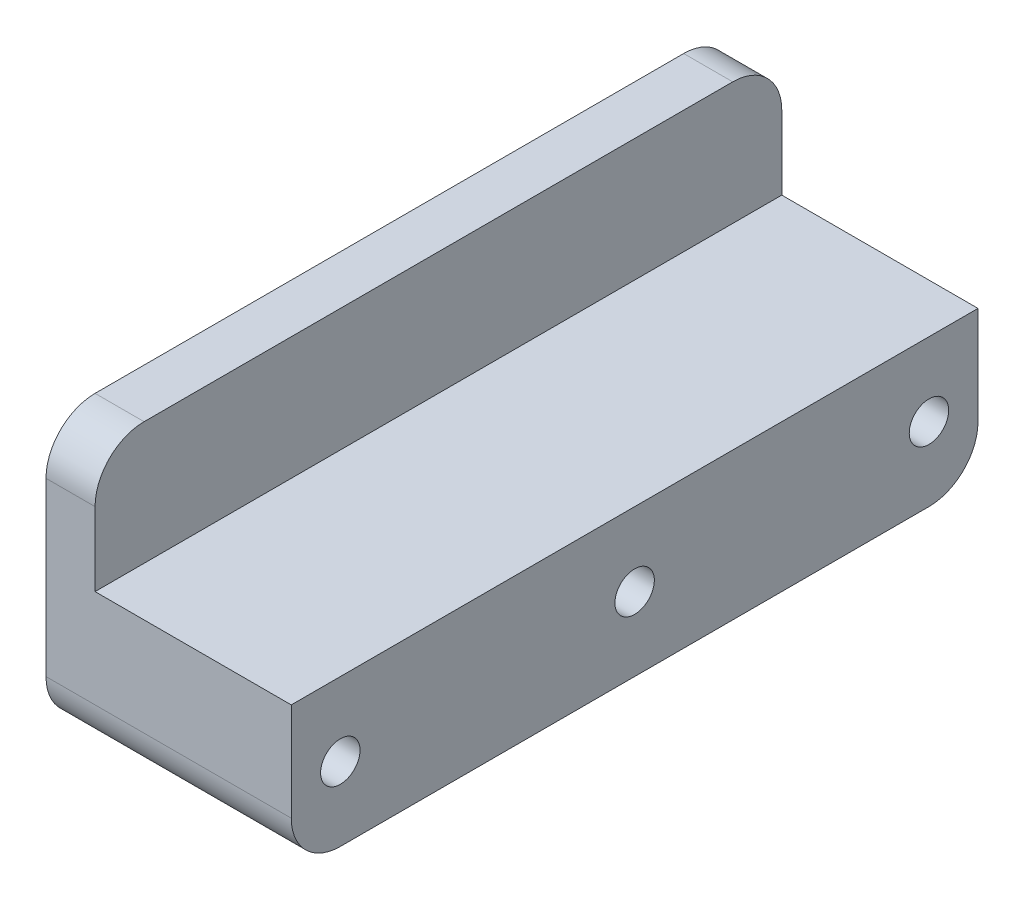
ISO-10303-21;
HEADER;
FILE_DESCRIPTION(('STEP AP214'),'2;1');
FILE_NAME('part.step','',(''),(''),'','','');
FILE_SCHEMA(('AUTOMOTIVE_DESIGN { 1 0 10303 214 1 1 1 1 }'));
ENDSEC;
DATA;
#1=APPLICATION_CONTEXT('core data for automotive mechanical design processes');
#2=APPLICATION_PROTOCOL_DEFINITION('international standard','automotive_design',2000,#1);
#3=PRODUCT_CONTEXT('',#1,'mechanical');
#4=PRODUCT('Part','Part','',(#3));
#5=PRODUCT_RELATED_PRODUCT_CATEGORY('part','',(#4));
#6=PRODUCT_DEFINITION_FORMATION('','',#4);
#7=PRODUCT_DEFINITION_CONTEXT('part definition',#1,'design');
#8=PRODUCT_DEFINITION('design','',#6,#7);
#9=PRODUCT_DEFINITION_SHAPE('','',#8);
#10=(LENGTH_UNIT() NAMED_UNIT(*) SI_UNIT(.MILLI.,.METRE.));
#11=(NAMED_UNIT(*) PLANE_ANGLE_UNIT() SI_UNIT($,.RADIAN.));
#12=(NAMED_UNIT(*) SI_UNIT($,.STERADIAN.) SOLID_ANGLE_UNIT());
#13=UNCERTAINTY_MEASURE_WITH_UNIT(LENGTH_MEASURE(1.E-05),#10,'distance_accuracy_value','');
#14=(GEOMETRIC_REPRESENTATION_CONTEXT(3) GLOBAL_UNCERTAINTY_ASSIGNED_CONTEXT((#13)) GLOBAL_UNIT_ASSIGNED_CONTEXT((#10,
#11,#12)) REPRESENTATION_CONTEXT('',''));
#15=CARTESIAN_POINT('',(0.,0.,0.));
#16=DIRECTION('',(0.,0.,1.));
#17=DIRECTION('',(1.,0.,0.));
#18=AXIS2_PLACEMENT_3D('',#15,#16,#17);
#19=CARTESIAN_POINT('',(317.498,-30.8912950776032,368.3));
#20=DIRECTION('',(1.,0.,0.));
#21=DIRECTION('',(0.,1.,0.));
#22=AXIS2_PLACEMENT_3D('',#19,#20,#21);
#23=CYLINDRICAL_SURFACE('',#22,2.5527);
#24=CARTESIAN_POINT('',(342.9,-30.8912950776032,368.3));
#25=DIRECTION('',(1.,0.,0.));
#26=DIRECTION('',(0.,1.,0.));
#27=AXIS2_PLACEMENT_3D('',#24,#25,#26);
#28=CIRCLE('',#27,2.5527);
#29=CARTESIAN_POINT('',(342.9,-28.3385950776032,368.3));
#30=VERTEX_POINT('',#29);
#31=EDGE_CURVE('E440',#30,#30,#28,.T.);
#32=ORIENTED_EDGE('',*,*,#31,.T.);
#33=EDGE_LOOP('',(#32));
#34=FACE_BOUND('',#33,.T.);
#35=CARTESIAN_POINT('',(336.55,-30.8912950776032,368.3));
#36=DIRECTION('',(-1.,0.,0.));
#37=DIRECTION('',(0.,-1.,0.));
#38=AXIS2_PLACEMENT_3D('',#35,#36,#37);
#39=CIRCLE('',#38,2.5527);
#40=CARTESIAN_POINT('',(336.55,-33.4439950776032,368.3));
#41=VERTEX_POINT('',#40);
#42=EDGE_CURVE('E21',#41,#41,#39,.F.);
#43=ORIENTED_EDGE('',*,*,#42,.F.);
#44=EDGE_LOOP('',(#43));
#45=FACE_BOUND('',#44,.T.);
#46=ADVANCED_FACE('F17',(#34,#45),#23,.F.);
#47=CARTESIAN_POINT('',(317.498,-30.8912950776032,406.4));
#48=DIRECTION('',(1.,0.,0.));
#49=DIRECTION('',(0.,1.,0.));
#50=AXIS2_PLACEMENT_3D('',#47,#48,#49);
#51=CYLINDRICAL_SURFACE('',#50,2.5527);
#52=CARTESIAN_POINT('',(342.9,-30.8912950776032,406.4));
#53=DIRECTION('',(1.,0.,0.));
#54=DIRECTION('',(0.,1.,0.));
#55=AXIS2_PLACEMENT_3D('',#52,#53,#54);
#56=CIRCLE('',#55,2.5527);
#57=CARTESIAN_POINT('',(342.9,-28.3385950776032,406.4));
#58=VERTEX_POINT('',#57);
#59=EDGE_CURVE('E435',#58,#58,#56,.T.);
#60=ORIENTED_EDGE('',*,*,#59,.T.);
#61=EDGE_LOOP('',(#60));
#62=FACE_BOUND('',#61,.T.);
#63=CARTESIAN_POINT('',(336.55,-30.8912950776032,406.4));
#64=DIRECTION('',(-1.,0.,0.));
#65=DIRECTION('',(0.,-1.,0.));
#66=AXIS2_PLACEMENT_3D('',#63,#64,#65);
#67=CIRCLE('',#66,2.5527);
#68=CARTESIAN_POINT('',(336.55,-33.4439950776032,406.4));
#69=VERTEX_POINT('',#68);
#70=EDGE_CURVE('E519',#69,#69,#67,.F.);
#71=ORIENTED_EDGE('',*,*,#70,.F.);
#72=EDGE_LOOP('',(#71));
#73=FACE_BOUND('',#72,.T.);
#74=ADVANCED_FACE('F529',(#62,#73),#51,.F.);
#75=CARTESIAN_POINT('',(317.498,-30.8912950776032,444.5));
#76=DIRECTION('',(1.,0.,0.));
#77=DIRECTION('',(0.,1.,0.));
#78=AXIS2_PLACEMENT_3D('',#75,#76,#77);
#79=CYLINDRICAL_SURFACE('',#78,2.5527);
#80=CARTESIAN_POINT('',(342.9,-30.8912950776032,444.5));
#81=DIRECTION('',(1.,0.,0.));
#82=DIRECTION('',(0.,1.,0.));
#83=AXIS2_PLACEMENT_3D('',#80,#81,#82);
#84=CIRCLE('',#83,2.5527);
#85=CARTESIAN_POINT('',(342.9,-28.3385950776032,444.5));
#86=VERTEX_POINT('',#85);
#87=EDGE_CURVE('E431',#86,#86,#84,.T.);
#88=ORIENTED_EDGE('',*,*,#87,.T.);
#89=EDGE_LOOP('',(#88));
#90=FACE_BOUND('',#89,.T.);
#91=CARTESIAN_POINT('',(336.55,-30.8912950776032,444.5));
#92=DIRECTION('',(-1.,0.,0.));
#93=DIRECTION('',(0.,-1.,0.));
#94=AXIS2_PLACEMENT_3D('',#91,#92,#93);
#95=CIRCLE('',#94,2.5527);
#96=CARTESIAN_POINT('',(336.55,-33.4439950776032,444.5));
#97=VERTEX_POINT('',#96);
#98=EDGE_CURVE('E265',#97,#97,#95,.F.);
#99=ORIENTED_EDGE('',*,*,#98,.F.);
#100=EDGE_LOOP('',(#99));
#101=FACE_BOUND('',#100,.T.);
#102=ADVANCED_FACE('F535',(#90,#101),#79,.F.);
#103=CARTESIAN_POINT('',(317.498,-40.4162950776019,406.4));
#104=DIRECTION('',(0.,1.,0.));
#105=DIRECTION('',(-1.,0.,0.));
#106=AXIS2_PLACEMENT_3D('',#103,#104,#105);
#107=PLANE('',#106);
#108=DIRECTION('',(0.,0.,1.));
#109=VECTOR('',#108,1.);
#110=CARTESIAN_POINT('',(311.15,-40.4162950776019,406.4));
#111=LINE('',#110,#109);
#112=CARTESIAN_POINT('',(311.15,-40.4162950776019,368.3));
#113=VERTEX_POINT('',#112);
#114=CARTESIAN_POINT('',(311.15,-40.4162950776019,444.5));
#115=VERTEX_POINT('',#114);
#116=EDGE_CURVE('E417',#113,#115,#111,.T.);
#117=ORIENTED_EDGE('',*,*,#116,.F.);
#118=DIRECTION('',(1.,0.,0.));
#119=VECTOR('',#118,1.);
#120=CARTESIAN_POINT('',(342.9,-40.4162950776019,368.3));
#121=LINE('',#120,#119);
#122=CARTESIAN_POINT('',(342.9,-40.4162950776019,368.3));
#123=VERTEX_POINT('',#122);
#124=EDGE_CURVE('E481',#113,#123,#121,.T.);
#125=ORIENTED_EDGE('',*,*,#124,.T.);
#126=DIRECTION('',(0.,0.,1.));
#127=VECTOR('',#126,1.);
#128=CARTESIAN_POINT('',(342.9,-40.4162950776019,406.4));
#129=LINE('',#128,#127);
#130=CARTESIAN_POINT('',(342.9,-40.4162950776019,444.5));
#131=VERTEX_POINT('',#130);
#132=EDGE_CURVE('E444',#123,#131,#129,.T.);
#133=ORIENTED_EDGE('',*,*,#132,.T.);
#134=DIRECTION('',(1.,0.,0.));
#135=VECTOR('',#134,1.);
#136=CARTESIAN_POINT('',(317.498,-40.4162950776019,444.5));
#137=LINE('',#136,#135);
#138=EDGE_CURVE('E474',#131,#115,#137,.F.);
#139=ORIENTED_EDGE('',*,*,#138,.T.);
#140=EDGE_LOOP('',(#117,#125,#133,#139));
#141=FACE_BOUND('',#140,.T.);
#142=ADVANCED_FACE('F594',(#141),#107,.F.);
#143=CARTESIAN_POINT('',(317.498,-30.8912950776032,361.95));
#144=DIRECTION('',(0.,0.,-1.));
#145=DIRECTION('',(-1.,0.,0.));
#146=AXIS2_PLACEMENT_3D('',#143,#144,#145);
#147=PLANE('',#146);
#148=DIRECTION('',(0.,1.,0.));
#149=VECTOR('',#148,1.);
#150=CARTESIAN_POINT('',(311.15,-22.9537950776019,361.95));
#151=LINE('',#150,#149);
#152=CARTESIAN_POINT('',(311.15,-34.0662950776019,361.95));
#153=VERTEX_POINT('',#152);
#154=CARTESIAN_POINT('',(311.15,-11.8412950776019,361.95));
#155=VERTEX_POINT('',#154);
#156=EDGE_CURVE('E405',#153,#155,#151,.T.);
#157=ORIENTED_EDGE('',*,*,#156,.T.);
#158=DIRECTION('',(1.,0.,0.));
#159=VECTOR('',#158,1.);
#160=CARTESIAN_POINT('',(317.498,-11.8412950776019,361.95));
#161=LINE('',#160,#159);
#162=CARTESIAN_POINT('',(317.5,-11.8412950776019,361.95));
#163=VERTEX_POINT('',#162);
#164=EDGE_CURVE('E508',#155,#163,#161,.T.);
#165=ORIENTED_EDGE('',*,*,#164,.T.);
#166=DIRECTION('',(0.,1.,0.));
#167=VECTOR('',#166,1.);
#168=CARTESIAN_POINT('',(317.5,-22.9537950776019,361.95));
#169=LINE('',#168,#167);
#170=CARTESIAN_POINT('',(317.5,-21.3662950776046,361.95));
#171=VERTEX_POINT('',#170);
#172=EDGE_CURVE('E421',#171,#163,#169,.T.);
#173=ORIENTED_EDGE('',*,*,#172,.F.);
#174=DIRECTION('',(1.,0.,0.));
#175=VECTOR('',#174,1.);
#176=CARTESIAN_POINT('',(317.498,-21.3662950776046,361.95));
#177=LINE('',#176,#175);
#178=CARTESIAN_POINT('',(342.9,-21.3662950776046,361.95));
#179=VERTEX_POINT('',#178);
#180=EDGE_CURVE('E460',#171,#179,#177,.T.);
#181=ORIENTED_EDGE('',*,*,#180,.T.);
#182=DIRECTION('',(0.,1.,0.));
#183=VECTOR('',#182,1.);
#184=CARTESIAN_POINT('',(342.9,-30.8912950776032,361.95));
#185=LINE('',#184,#183);
#186=CARTESIAN_POINT('',(342.9,-34.0662950776019,361.95));
#187=VERTEX_POINT('',#186);
#188=EDGE_CURVE('E446',#187,#179,#185,.T.);
#189=ORIENTED_EDGE('',*,*,#188,.F.);
#190=DIRECTION('',(1.,0.,0.));
#191=VECTOR('',#190,1.);
#192=CARTESIAN_POINT('',(311.15,-34.0662950776019,361.95));
#193=LINE('',#192,#191);
#194=EDGE_CURVE('E488',#187,#153,#193,.F.);
#195=ORIENTED_EDGE('',*,*,#194,.T.);
#196=EDGE_LOOP('',(#157,#165,#173,#181,#189,#195));
#197=FACE_BOUND('',#196,.T.);
#198=ADVANCED_FACE('F588',(#197),#147,.T.);
#199=CARTESIAN_POINT('',(317.498,-21.3662950776045,269.340730464818));
#200=DIRECTION('',(0.,-1.,0.));
#201=DIRECTION('',(0.,0.,-1.));
#202=AXIS2_PLACEMENT_3D('',#199,#200,#201);
#203=PLANE('',#202);
#204=DIRECTION('',(0.,0.,-1.));
#205=VECTOR('',#204,1.);
#206=CARTESIAN_POINT('',(317.5,-21.3662950776045,269.340730464818));
#207=LINE('',#206,#205);
#208=CARTESIAN_POINT('',(317.5,-21.3662950776046,450.85));
#209=VERTEX_POINT('',#208);
#210=EDGE_CURVE('E420',#209,#171,#207,.T.);
#211=ORIENTED_EDGE('',*,*,#210,.F.);
#212=DIRECTION('',(1.,0.,0.));
#213=VECTOR('',#212,1.);
#214=CARTESIAN_POINT('',(317.498,-21.3662950776046,450.85));
#215=LINE('',#214,#213);
#216=CARTESIAN_POINT('',(342.9,-21.3662950776046,450.85));
#217=VERTEX_POINT('',#216);
#218=EDGE_CURVE('E436',#209,#217,#215,.T.);
#219=ORIENTED_EDGE('',*,*,#218,.T.);
#220=DIRECTION('',(0.,0.,-1.));
#221=VECTOR('',#220,1.);
#222=CARTESIAN_POINT('',(342.9,-21.3662950776045,269.340730464818));
#223=LINE('',#222,#221);
#224=EDGE_CURVE('E449',#217,#179,#223,.T.);
#225=ORIENTED_EDGE('',*,*,#224,.T.);
#226=ORIENTED_EDGE('',*,*,#180,.F.);
#227=EDGE_LOOP('',(#211,#219,#225,#226));
#228=FACE_BOUND('',#227,.T.);
#229=ADVANCED_FACE('F575',(#228),#203,.F.);
#230=CARTESIAN_POINT('',(317.498,-30.8912950776032,450.85));
#231=DIRECTION('',(0.,0.,-1.));
#232=DIRECTION('',(-1.,0.,0.));
#233=AXIS2_PLACEMENT_3D('',#230,#231,#232);
#234=PLANE('',#233);
#235=DIRECTION('',(0.,1.,0.));
#236=VECTOR('',#235,1.);
#237=CARTESIAN_POINT('',(317.5,-22.9537950776019,450.85));
#238=LINE('',#237,#236);
#239=CARTESIAN_POINT('',(317.5,-11.8412950776019,450.85));
#240=VERTEX_POINT('',#239);
#241=EDGE_CURVE('E425',#209,#240,#238,.T.);
#242=ORIENTED_EDGE('',*,*,#241,.T.);
#243=DIRECTION('',(1.,0.,0.));
#244=VECTOR('',#243,1.);
#245=CARTESIAN_POINT('',(311.15,-11.8412950776019,450.85));
#246=LINE('',#245,#244);
#247=CARTESIAN_POINT('',(311.15,-11.8412950776019,450.85));
#248=VERTEX_POINT('',#247);
#249=EDGE_CURVE('E501',#240,#248,#246,.F.);
#250=ORIENTED_EDGE('',*,*,#249,.T.);
#251=DIRECTION('',(0.,1.,0.));
#252=VECTOR('',#251,1.);
#253=CARTESIAN_POINT('',(311.15,-22.9537950776019,450.85));
#254=LINE('',#253,#252);
#255=CARTESIAN_POINT('',(311.15,-34.0662950776019,450.85));
#256=VERTEX_POINT('',#255);
#257=EDGE_CURVE('E409',#256,#248,#254,.T.);
#258=ORIENTED_EDGE('',*,*,#257,.F.);
#259=DIRECTION('',(1.,0.,0.));
#260=VECTOR('',#259,1.);
#261=CARTESIAN_POINT('',(317.498,-34.0662950776019,450.85));
#262=LINE('',#261,#260);
#263=CARTESIAN_POINT('',(342.9,-34.0662950776019,450.85));
#264=VERTEX_POINT('',#263);
#265=EDGE_CURVE('E456',#256,#264,#262,.T.);
#266=ORIENTED_EDGE('',*,*,#265,.T.);
#267=DIRECTION('',(0.,1.,0.));
#268=VECTOR('',#267,1.);
#269=CARTESIAN_POINT('',(342.9,-30.8912950776032,450.85));
#270=LINE('',#269,#268);
#271=EDGE_CURVE('E453',#264,#217,#270,.T.);
#272=ORIENTED_EDGE('',*,*,#271,.T.);
#273=ORIENTED_EDGE('',*,*,#218,.F.);
#274=EDGE_LOOP('',(#242,#250,#258,#266,#272,#273));
#275=FACE_BOUND('',#274,.T.);
#276=ADVANCED_FACE('F566',(#275),#234,.F.);
#277=CARTESIAN_POINT('',(342.9,4.03370492239605,323.85));
#278=DIRECTION('',(1.,0.,0.));
#279=DIRECTION('',(0.,1.,0.));
#280=AXIS2_PLACEMENT_3D('',#277,#278,#279);
#281=PLANE('',#280);
#282=ORIENTED_EDGE('',*,*,#87,.F.);
#283=EDGE_LOOP('',(#282));
#284=FACE_BOUND('',#283,.T.);
#285=ORIENTED_EDGE('',*,*,#59,.F.);
#286=EDGE_LOOP('',(#285));
#287=FACE_BOUND('',#286,.T.);
#288=ORIENTED_EDGE('',*,*,#31,.F.);
#289=EDGE_LOOP('',(#288));
#290=FACE_BOUND('',#289,.T.);
#291=ORIENTED_EDGE('',*,*,#132,.F.);
#292=CARTESIAN_POINT('',(342.9,-34.0662950776019,368.3));
#293=DIRECTION('',(1.,0.,0.));
#294=DIRECTION('',(0.,1.,0.));
#295=AXIS2_PLACEMENT_3D('',#292,#293,#294);
#296=CIRCLE('',#295,6.35);
#297=EDGE_CURVE('E485',#123,#187,#296,.T.);
#298=ORIENTED_EDGE('',*,*,#297,.T.);
#299=ORIENTED_EDGE('',*,*,#188,.T.);
#300=ORIENTED_EDGE('',*,*,#224,.F.);
#301=ORIENTED_EDGE('',*,*,#271,.F.);
#302=CARTESIAN_POINT('',(342.9,-34.0662950776019,444.5));
#303=DIRECTION('',(1.,0.,0.));
#304=DIRECTION('',(0.,1.,0.));
#305=AXIS2_PLACEMENT_3D('',#302,#303,#304);
#306=CIRCLE('',#305,6.35);
#307=EDGE_CURVE('E470',#264,#131,#306,.T.);
#308=ORIENTED_EDGE('',*,*,#307,.T.);
#309=EDGE_LOOP('',(#291,#298,#299,#300,#301,#308));
#310=FACE_BOUND('',#309,.T.);
#311=ADVANCED_FACE('F571',(#284,#287,#290,#310),#281,.T.);
#312=CARTESIAN_POINT('',(317.5,4.03370492239814,406.4));
#313=DIRECTION('',(-1.,0.,0.));
#314=DIRECTION('',(0.,-1.,0.));
#315=AXIS2_PLACEMENT_3D('',#312,#313,#314);
#316=PLANE('',#315);
#317=ORIENTED_EDGE('',*,*,#172,.T.);
#318=CARTESIAN_POINT('',(317.5,-11.8412950776019,368.3));
#319=DIRECTION('',(-1.,0.,0.));
#320=DIRECTION('',(0.,-1.,0.));
#321=AXIS2_PLACEMENT_3D('',#318,#319,#320);
#322=CIRCLE('',#321,6.35);
#323=CARTESIAN_POINT('',(317.5,-5.4912950776019,368.3));
#324=VERTEX_POINT('',#323);
#325=EDGE_CURVE('E512',#163,#324,#322,.F.);
#326=ORIENTED_EDGE('',*,*,#325,.T.);
#327=DIRECTION('',(0.,0.,1.));
#328=VECTOR('',#327,1.);
#329=CARTESIAN_POINT('',(317.5,-5.4912950776019,406.4));
#330=LINE('',#329,#328);
#331=CARTESIAN_POINT('',(317.5,-5.49129507760189,444.5));
#332=VERTEX_POINT('',#331);
#333=EDGE_CURVE('E410',#324,#332,#330,.T.);
#334=ORIENTED_EDGE('',*,*,#333,.T.);
#335=CARTESIAN_POINT('',(317.5,-11.8412950776019,444.5));
#336=DIRECTION('',(-1.,0.,0.));
#337=DIRECTION('',(0.,-1.,0.));
#338=AXIS2_PLACEMENT_3D('',#335,#336,#337);
#339=CIRCLE('',#338,6.35);
#340=EDGE_CURVE('E498',#332,#240,#339,.F.);
#341=ORIENTED_EDGE('',*,*,#340,.T.);
#342=ORIENTED_EDGE('',*,*,#241,.F.);
#343=ORIENTED_EDGE('',*,*,#210,.T.);
#344=EDGE_LOOP('',(#317,#326,#334,#341,#342,#343));
#345=FACE_BOUND('',#344,.T.);
#346=ADVANCED_FACE('F579',(#345),#316,.F.);
#347=CARTESIAN_POINT('',(311.15,-5.49129507760189,406.4));
#348=DIRECTION('',(0.,1.,0.));
#349=DIRECTION('',(-1.,0.,0.));
#350=AXIS2_PLACEMENT_3D('',#347,#348,#349);
#351=PLANE('',#350);
#352=ORIENTED_EDGE('',*,*,#333,.F.);
#353=DIRECTION('',(1.,0.,0.));
#354=VECTOR('',#353,1.);
#355=CARTESIAN_POINT('',(311.15,-5.4912950776019,368.3));
#356=LINE('',#355,#354);
#357=CARTESIAN_POINT('',(311.15,-5.4912950776019,368.3));
#358=VERTEX_POINT('',#357);
#359=EDGE_CURVE('E27',#324,#358,#356,.F.);
#360=ORIENTED_EDGE('',*,*,#359,.T.);
#361=DIRECTION('',(0.,0.,1.));
#362=VECTOR('',#361,1.);
#363=CARTESIAN_POINT('',(311.15,-5.49129507760189,406.4));
#364=LINE('',#363,#362);
#365=CARTESIAN_POINT('',(311.15,-5.49129507760189,444.5));
#366=VERTEX_POINT('',#365);
#367=EDGE_CURVE('E414',#358,#366,#364,.T.);
#368=ORIENTED_EDGE('',*,*,#367,.T.);
#369=DIRECTION('',(1.,0.,0.));
#370=VECTOR('',#369,1.);
#371=CARTESIAN_POINT('',(317.5,-5.49129507760189,444.5));
#372=LINE('',#371,#370);
#373=EDGE_CURVE('E494',#366,#332,#372,.T.);
#374=ORIENTED_EDGE('',*,*,#373,.T.);
#375=EDGE_LOOP('',(#352,#360,#368,#374));
#376=FACE_BOUND('',#375,.T.);
#377=ADVANCED_FACE('F582',(#376),#351,.T.);
#378=CARTESIAN_POINT('',(311.15,4.03370492239814,406.4));
#379=DIRECTION('',(-1.,0.,0.));
#380=DIRECTION('',(0.,-1.,0.));
#381=AXIS2_PLACEMENT_3D('',#378,#379,#380);
#382=PLANE('',#381);
#383=DIRECTION('',(0.,0.,-1.));
#384=VECTOR('',#383,1.);
#385=CARTESIAN_POINT('',(311.15,-26.0412950776032,368.3));
#386=LINE('',#385,#384);
#387=CARTESIAN_POINT('',(311.15,-26.0412950776032,371.10014880557));
#388=VERTEX_POINT('',#387);
#389=CARTESIAN_POINT('',(311.15,-26.0412950776032,365.499851194431));
#390=VERTEX_POINT('',#389);
#391=EDGE_CURVE('E228',#388,#390,#386,.T.);
#392=ORIENTED_EDGE('',*,*,#391,.F.);
#393=DIRECTION('',(0.,0.86602540378444,-0.5));
#394=VECTOR('',#393,1.);
#395=CARTESIAN_POINT('',(311.15,-28.4662950776032,372.500223208354));
#396=LINE('',#395,#394);
#397=CARTESIAN_POINT('',(311.15,-30.8912950776032,373.900297611139));
#398=VERTEX_POINT('',#397);
#399=EDGE_CURVE('E209',#398,#388,#396,.T.);
#400=ORIENTED_EDGE('',*,*,#399,.F.);
#401=DIRECTION('',(0.,0.866025403784438,0.5));
#402=VECTOR('',#401,1.);
#403=CARTESIAN_POINT('',(311.15,-33.3162950776033,372.500223208354));
#404=LINE('',#403,#402);
#405=CARTESIAN_POINT('',(311.15,-35.7412950776032,371.10014880557));
#406=VERTEX_POINT('',#405);
#407=EDGE_CURVE('E35',#406,#398,#404,.T.);
#408=ORIENTED_EDGE('',*,*,#407,.F.);
#409=DIRECTION('',(0.,0.,1.));
#410=VECTOR('',#409,1.);
#411=CARTESIAN_POINT('',(311.15,-35.7412950776032,368.3));
#412=LINE('',#411,#410);
#413=CARTESIAN_POINT('',(311.15,-35.7412950776032,365.499851194431));
#414=VERTEX_POINT('',#413);
#415=EDGE_CURVE('E249',#414,#406,#412,.T.);
#416=ORIENTED_EDGE('',*,*,#415,.F.);
#417=DIRECTION('',(0.,-0.86602540378444,0.5));
#418=VECTOR('',#417,1.);
#419=CARTESIAN_POINT('',(311.15,-33.3162950776033,364.099776791646));
#420=LINE('',#419,#418);
#421=CARTESIAN_POINT('',(311.15,-30.8912950776032,362.699702388861));
#422=VERTEX_POINT('',#421);
#423=EDGE_CURVE('E253',#422,#414,#420,.T.);
#424=ORIENTED_EDGE('',*,*,#423,.F.);
#425=DIRECTION('',(0.,-0.866025403784439,-0.5));
#426=VECTOR('',#425,1.);
#427=CARTESIAN_POINT('',(311.15,-28.4662950776032,364.099776791646));
#428=LINE('',#427,#426);
#429=EDGE_CURVE('E257',#390,#422,#428,.T.);
#430=ORIENTED_EDGE('',*,*,#429,.F.);
#431=EDGE_LOOP('',(#392,#400,#408,#416,#424,#430));
#432=FACE_BOUND('',#431,.T.);
#433=DIRECTION('',(0.,0.,-1.));
#434=VECTOR('',#433,1.);
#435=CARTESIAN_POINT('',(311.15,-26.0412950776032,406.4));
#436=LINE('',#435,#434);
#437=CARTESIAN_POINT('',(311.15,-26.0412950776032,409.20014880557));
#438=VERTEX_POINT('',#437);
#439=CARTESIAN_POINT('',(311.15,-26.0412950776032,403.599851194431));
#440=VERTEX_POINT('',#439);
#441=EDGE_CURVE('E302',#438,#440,#436,.T.);
#442=ORIENTED_EDGE('',*,*,#441,.F.);
#443=DIRECTION('',(0.,0.86602540378444,-0.5));
#444=VECTOR('',#443,1.);
#445=CARTESIAN_POINT('',(311.15,-28.4662950776032,410.600223208354));
#446=LINE('',#445,#444);
#447=CARTESIAN_POINT('',(311.15,-30.8912950776032,412.00029761114));
#448=VERTEX_POINT('',#447);
#449=EDGE_CURVE('E282',#448,#438,#446,.T.);
#450=ORIENTED_EDGE('',*,*,#449,.F.);
#451=DIRECTION('',(0.,0.866025403784438,0.5));
#452=VECTOR('',#451,1.);
#453=CARTESIAN_POINT('',(311.15,-33.3162950776033,410.600223208354));
#454=LINE('',#453,#452);
#455=CARTESIAN_POINT('',(311.15,-35.7412950776033,409.20014880557));
#456=VERTEX_POINT('',#455);
#457=EDGE_CURVE('E43',#456,#448,#454,.T.);
#458=ORIENTED_EDGE('',*,*,#457,.F.);
#459=DIRECTION('',(0.,0.,1.));
#460=VECTOR('',#459,1.);
#461=CARTESIAN_POINT('',(311.15,-35.7412950776032,406.4));
#462=LINE('',#461,#460);
#463=CARTESIAN_POINT('',(311.15,-35.7412950776032,403.599851194431));
#464=VERTEX_POINT('',#463);
#465=EDGE_CURVE('E315',#464,#456,#462,.T.);
#466=ORIENTED_EDGE('',*,*,#465,.F.);
#467=DIRECTION('',(0.,-0.86602540378444,0.5));
#468=VECTOR('',#467,1.);
#469=CARTESIAN_POINT('',(311.15,-33.3162950776033,402.199776791646));
#470=LINE('',#469,#468);
#471=CARTESIAN_POINT('',(311.15,-30.8912950776032,400.79970238886));
#472=VERTEX_POINT('',#471);
#473=EDGE_CURVE('E311',#472,#464,#470,.T.);
#474=ORIENTED_EDGE('',*,*,#473,.F.);
#475=DIRECTION('',(0.,-0.866025403784439,-0.5));
#476=VECTOR('',#475,1.);
#477=CARTESIAN_POINT('',(311.15,-28.4662950776032,402.199776791646));
#478=LINE('',#477,#476);
#479=EDGE_CURVE('E306',#440,#472,#478,.T.);
#480=ORIENTED_EDGE('',*,*,#479,.F.);
#481=EDGE_LOOP('',(#442,#450,#458,#466,#474,#480));
#482=FACE_BOUND('',#481,.T.);
#483=DIRECTION('',(0.,0.86602540378444,-0.5));
#484=VECTOR('',#483,1.);
#485=CARTESIAN_POINT('',(311.15,-28.4662950776032,448.700223208354));
#486=LINE('',#485,#484);
#487=CARTESIAN_POINT('',(311.15,-30.8912950776032,450.10029761114));
#488=VERTEX_POINT('',#487);
#489=CARTESIAN_POINT('',(311.15,-26.0412950776032,447.30014880557));
#490=VERTEX_POINT('',#489);
#491=EDGE_CURVE('E345',#488,#490,#486,.T.);
#492=ORIENTED_EDGE('',*,*,#491,.F.);
#493=DIRECTION('',(0.,0.866025403784438,0.5));
#494=VECTOR('',#493,1.);
#495=CARTESIAN_POINT('',(311.15,-33.3162950776033,448.700223208354));
#496=LINE('',#495,#494);
#497=CARTESIAN_POINT('',(311.15,-35.7412950776032,447.30014880557));
#498=VERTEX_POINT('',#497);
#499=EDGE_CURVE('E366',#498,#488,#496,.T.);
#500=ORIENTED_EDGE('',*,*,#499,.F.);
#501=DIRECTION('',(0.,0.,1.));
#502=VECTOR('',#501,1.);
#503=CARTESIAN_POINT('',(311.15,-35.7412950776032,444.5));
#504=LINE('',#503,#502);
#505=CARTESIAN_POINT('',(311.15,-35.7412950776032,441.69985119443));
#506=VERTEX_POINT('',#505);
#507=EDGE_CURVE('E370',#506,#498,#504,.T.);
#508=ORIENTED_EDGE('',*,*,#507,.F.);
#509=DIRECTION('',(0.,-0.86602540378444,0.5));
#510=VECTOR('',#509,1.);
#511=CARTESIAN_POINT('',(311.15,-33.3162950776033,440.299776791646));
#512=LINE('',#511,#510);
#513=CARTESIAN_POINT('',(311.15,-30.8912950776032,438.89970238886));
#514=VERTEX_POINT('',#513);
#515=EDGE_CURVE('E373',#514,#506,#512,.T.);
#516=ORIENTED_EDGE('',*,*,#515,.F.);
#517=DIRECTION('',(0.,-0.866025403784439,-0.5));
#518=VECTOR('',#517,1.);
#519=CARTESIAN_POINT('',(311.15,-28.4662950776032,440.299776791646));
#520=LINE('',#519,#518);
#521=CARTESIAN_POINT('',(311.15,-26.0412950776032,441.69985119443));
#522=VERTEX_POINT('',#521);
#523=EDGE_CURVE('E377',#522,#514,#520,.T.);
#524=ORIENTED_EDGE('',*,*,#523,.F.);
#525=DIRECTION('',(0.,0.,-1.));
#526=VECTOR('',#525,1.);
#527=CARTESIAN_POINT('',(311.15,-26.0412950776032,444.5));
#528=LINE('',#527,#526);
#529=EDGE_CURVE('E381',#490,#522,#528,.T.);
#530=ORIENTED_EDGE('',*,*,#529,.F.);
#531=EDGE_LOOP('',(#492,#500,#508,#516,#524,#530));
#532=FACE_BOUND('',#531,.T.);
#533=ORIENTED_EDGE('',*,*,#367,.F.);
#534=CARTESIAN_POINT('',(311.15,-11.8412950776019,368.3));
#535=DIRECTION('',(-1.,0.,0.));
#536=DIRECTION('',(0.,-1.,0.));
#537=AXIS2_PLACEMENT_3D('',#534,#535,#536);
#538=CIRCLE('',#537,6.35);
#539=EDGE_CURVE('E11',#358,#155,#538,.T.);
#540=ORIENTED_EDGE('',*,*,#539,.T.);
#541=ORIENTED_EDGE('',*,*,#156,.F.);
#542=CARTESIAN_POINT('',(311.15,-34.0662950776019,368.3));
#543=DIRECTION('',(-1.,0.,0.));
#544=DIRECTION('',(0.,-1.,0.));
#545=AXIS2_PLACEMENT_3D('',#542,#543,#544);
#546=CIRCLE('',#545,6.35);
#547=EDGE_CURVE('E491',#153,#113,#546,.T.);
#548=ORIENTED_EDGE('',*,*,#547,.T.);
#549=ORIENTED_EDGE('',*,*,#116,.T.);
#550=CARTESIAN_POINT('',(311.15,-34.0662950776019,444.5));
#551=DIRECTION('',(-1.,0.,0.));
#552=DIRECTION('',(0.,-1.,0.));
#553=AXIS2_PLACEMENT_3D('',#550,#551,#552);
#554=CIRCLE('',#553,6.35);
#555=EDGE_CURVE('E478',#115,#256,#554,.T.);
#556=ORIENTED_EDGE('',*,*,#555,.T.);
#557=ORIENTED_EDGE('',*,*,#257,.T.);
#558=CARTESIAN_POINT('',(311.15,-11.8412950776019,444.5));
#559=DIRECTION('',(-1.,0.,0.));
#560=DIRECTION('',(0.,-1.,0.));
#561=AXIS2_PLACEMENT_3D('',#558,#559,#560);
#562=CIRCLE('',#561,6.35);
#563=EDGE_CURVE('E504',#248,#366,#562,.T.);
#564=ORIENTED_EDGE('',*,*,#563,.T.);
#565=EDGE_LOOP('',(#533,#540,#541,#548,#549,#556,#557,#564));
#566=FACE_BOUND('',#565,.T.);
#567=ADVANCED_FACE('F544',(#432,#482,#532,#566),#382,.T.);
#568=CARTESIAN_POINT('',(317.498,-34.0662950776019,444.5));
#569=DIRECTION('',(1.,0.,0.));
#570=DIRECTION('',(0.,1.,0.));
#571=AXIS2_PLACEMENT_3D('',#568,#569,#570);
#572=CYLINDRICAL_SURFACE('',#571,6.35);
#573=ORIENTED_EDGE('',*,*,#555,.F.);
#574=ORIENTED_EDGE('',*,*,#138,.F.);
#575=ORIENTED_EDGE('',*,*,#307,.F.);
#576=ORIENTED_EDGE('',*,*,#265,.F.);
#577=EDGE_LOOP('',(#573,#574,#575,#576));
#578=FACE_BOUND('',#577,.T.);
#579=ADVANCED_FACE('F540',(#578),#572,.T.);
#580=CARTESIAN_POINT('',(317.498,-34.0662950776019,368.3));
#581=DIRECTION('',(-1.,0.,0.));
#582=DIRECTION('',(0.,-1.,0.));
#583=AXIS2_PLACEMENT_3D('',#580,#581,#582);
#584=CYLINDRICAL_SURFACE('',#583,6.35);
#585=ORIENTED_EDGE('',*,*,#547,.F.);
#586=ORIENTED_EDGE('',*,*,#194,.F.);
#587=ORIENTED_EDGE('',*,*,#297,.F.);
#588=ORIENTED_EDGE('',*,*,#124,.F.);
#589=EDGE_LOOP('',(#585,#586,#587,#588));
#590=FACE_BOUND('',#589,.T.);
#591=ADVANCED_FACE('F543',(#590),#584,.T.);
#592=CARTESIAN_POINT('',(311.15,-11.8412950776019,444.5));
#593=DIRECTION('',(-1.,0.,0.));
#594=DIRECTION('',(0.,-1.,0.));
#595=AXIS2_PLACEMENT_3D('',#592,#593,#594);
#596=CYLINDRICAL_SURFACE('',#595,6.35);
#597=ORIENTED_EDGE('',*,*,#563,.F.);
#598=ORIENTED_EDGE('',*,*,#249,.F.);
#599=ORIENTED_EDGE('',*,*,#340,.F.);
#600=ORIENTED_EDGE('',*,*,#373,.F.);
#601=EDGE_LOOP('',(#597,#598,#599,#600));
#602=FACE_BOUND('',#601,.T.);
#603=ADVANCED_FACE('F547',(#602),#596,.T.);
#604=CARTESIAN_POINT('',(317.498,-11.8412950776019,368.3));
#605=DIRECTION('',(1.,0.,0.));
#606=DIRECTION('',(0.,1.,0.));
#607=AXIS2_PLACEMENT_3D('',#604,#605,#606);
#608=CYLINDRICAL_SURFACE('',#607,6.35);
#609=ORIENTED_EDGE('',*,*,#539,.F.);
#610=ORIENTED_EDGE('',*,*,#359,.F.);
#611=ORIENTED_EDGE('',*,*,#325,.F.);
#612=ORIENTED_EDGE('',*,*,#164,.F.);
#613=EDGE_LOOP('',(#609,#610,#611,#612));
#614=FACE_BOUND('',#613,.T.);
#615=ADVANCED_FACE('F19',(#614),#608,.T.);
#616=CARTESIAN_POINT('',(336.55,1.69620492239822,406.4));
#617=DIRECTION('',(-1.,0.,0.));
#618=DIRECTION('',(0.,-1.,0.));
#619=AXIS2_PLACEMENT_3D('',#616,#617,#618);
#620=PLANE('',#619);
#621=DIRECTION('',(0.,0.86602540378444,-0.5));
#622=VECTOR('',#621,1.);
#623=CARTESIAN_POINT('',(336.55,-28.4662950776033,448.700223208354));
#624=LINE('',#623,#622);
#625=CARTESIAN_POINT('',(336.55,-30.8912950776033,450.10029761114));
#626=VERTEX_POINT('',#625);
#627=CARTESIAN_POINT('',(336.55,-26.0412950776033,447.30014880557));
#628=VERTEX_POINT('',#627);
#629=EDGE_CURVE('E361',#626,#628,#624,.T.);
#630=ORIENTED_EDGE('',*,*,#629,.T.);
#631=DIRECTION('',(0.,0.,-1.));
#632=VECTOR('',#631,1.);
#633=CARTESIAN_POINT('',(336.55,-26.0412950776032,444.5));
#634=LINE('',#633,#632);
#635=CARTESIAN_POINT('',(336.55,-26.0412950776033,441.69985119443));
#636=VERTEX_POINT('',#635);
#637=EDGE_CURVE('E357',#628,#636,#634,.T.);
#638=ORIENTED_EDGE('',*,*,#637,.T.);
#639=DIRECTION('',(0.,-0.866025403784439,-0.5));
#640=VECTOR('',#639,1.);
#641=CARTESIAN_POINT('',(336.55,-28.4662950776032,440.299776791646));
#642=LINE('',#641,#640);
#643=CARTESIAN_POINT('',(336.55,-30.8912950776032,438.89970238886));
#644=VERTEX_POINT('',#643);
#645=EDGE_CURVE('E353',#636,#644,#642,.T.);
#646=ORIENTED_EDGE('',*,*,#645,.T.);
#647=DIRECTION('',(0.,-0.86602540378444,0.5));
#648=VECTOR('',#647,1.);
#649=CARTESIAN_POINT('',(336.55,-33.3162950776033,440.299776791646));
#650=LINE('',#649,#648);
#651=CARTESIAN_POINT('',(336.55,-35.7412950776032,441.69985119443));
#652=VERTEX_POINT('',#651);
#653=EDGE_CURVE('E349',#644,#652,#650,.T.);
#654=ORIENTED_EDGE('',*,*,#653,.T.);
#655=DIRECTION('',(0.,0.,1.));
#656=VECTOR('',#655,1.);
#657=CARTESIAN_POINT('',(336.55,-35.7412950776032,444.5));
#658=LINE('',#657,#656);
#659=CARTESIAN_POINT('',(336.55,-35.7412950776032,447.30014880557));
#660=VERTEX_POINT('',#659);
#661=EDGE_CURVE('E344',#652,#660,#658,.T.);
#662=ORIENTED_EDGE('',*,*,#661,.T.);
#663=DIRECTION('',(0.,0.866025403784438,0.5));
#664=VECTOR('',#663,1.);
#665=CARTESIAN_POINT('',(336.55,-33.3162950776033,448.700223208354));
#666=LINE('',#665,#664);
#667=EDGE_CURVE('E340',#660,#626,#666,.T.);
#668=ORIENTED_EDGE('',*,*,#667,.T.);
#669=EDGE_LOOP('',(#630,#638,#646,#654,#662,#668));
#670=FACE_BOUND('',#669,.T.);
#671=ORIENTED_EDGE('',*,*,#98,.T.);
#672=EDGE_LOOP('',(#671));
#673=FACE_BOUND('',#672,.T.);
#674=ADVANCED_FACE('F553',(#670,#673),#620,.T.);
#675=CARTESIAN_POINT('',(336.55,-28.4662950776033,448.700223208354));
#676=DIRECTION('',(0.,0.5,0.86602540378444));
#677=DIRECTION('',(0.,-0.86602540378444,0.5));
#678=AXIS2_PLACEMENT_3D('',#675,#676,#677);
#679=PLANE('',#678);
#680=ORIENTED_EDGE('',*,*,#491,.T.);
#681=DIRECTION('',(-1.,0.,0.));
#682=VECTOR('',#681,1.);
#683=CARTESIAN_POINT('',(336.55,-26.0412950776033,447.30014880557));
#684=LINE('',#683,#682);
#685=EDGE_CURVE('E307',#628,#490,#684,.T.);
#686=ORIENTED_EDGE('',*,*,#685,.F.);
#687=ORIENTED_EDGE('',*,*,#629,.F.);
#688=DIRECTION('',(-1.,0.,0.));
#689=VECTOR('',#688,1.);
#690=CARTESIAN_POINT('',(336.55,-30.8912950776033,450.10029761114));
#691=LINE('',#690,#689);
#692=EDGE_CURVE('E365',#626,#488,#691,.T.);
#693=ORIENTED_EDGE('',*,*,#692,.T.);
#694=EDGE_LOOP('',(#680,#686,#687,#693));
#695=FACE_BOUND('',#694,.T.);
#696=ADVANCED_FACE('F702',(#695),#679,.F.);
#697=CARTESIAN_POINT('',(336.55,-26.0412950776032,444.5));
#698=DIRECTION('',(0.,1.,0.));
#699=DIRECTION('',(0.,0.,1.));
#700=AXIS2_PLACEMENT_3D('',#697,#698,#699);
#701=PLANE('',#700);
#702=ORIENTED_EDGE('',*,*,#529,.T.);
#703=DIRECTION('',(-1.,0.,0.));
#704=VECTOR('',#703,1.);
#705=CARTESIAN_POINT('',(336.55,-26.0412950776033,441.69985119443));
#706=LINE('',#705,#704);
#707=EDGE_CURVE('E390',#636,#522,#706,.T.);
#708=ORIENTED_EDGE('',*,*,#707,.F.);
#709=ORIENTED_EDGE('',*,*,#637,.F.);
#710=ORIENTED_EDGE('',*,*,#685,.T.);
#711=EDGE_LOOP('',(#702,#708,#709,#710));
#712=FACE_BOUND('',#711,.T.);
#713=ADVANCED_FACE('F711',(#712),#701,.F.);
#714=CARTESIAN_POINT('',(336.55,-28.4662950776032,440.299776791646));
#715=DIRECTION('',(0.,0.5,-0.866025403784438));
#716=DIRECTION('',(0.,0.866025403784438,0.5));
#717=AXIS2_PLACEMENT_3D('',#714,#715,#716);
#718=PLANE('',#717);
#719=ORIENTED_EDGE('',*,*,#523,.T.);
#720=DIRECTION('',(-1.,0.,0.));
#721=VECTOR('',#720,1.);
#722=CARTESIAN_POINT('',(336.55,-30.8912950776032,438.89970238886));
#723=LINE('',#722,#721);
#724=EDGE_CURVE('E393',#644,#514,#723,.T.);
#725=ORIENTED_EDGE('',*,*,#724,.F.);
#726=ORIENTED_EDGE('',*,*,#645,.F.);
#727=ORIENTED_EDGE('',*,*,#707,.T.);
#728=EDGE_LOOP('',(#719,#725,#726,#727));
#729=FACE_BOUND('',#728,.T.);
#730=ADVANCED_FACE('F720',(#729),#718,.F.);
#731=CARTESIAN_POINT('',(336.55,-33.3162950776033,440.299776791646));
#732=DIRECTION('',(0.,-0.5,-0.86602540378444));
#733=DIRECTION('',(0.,0.86602540378444,-0.5));
#734=AXIS2_PLACEMENT_3D('',#731,#732,#733);
#735=PLANE('',#734);
#736=ORIENTED_EDGE('',*,*,#515,.T.);
#737=DIRECTION('',(-1.,0.,0.));
#738=VECTOR('',#737,1.);
#739=CARTESIAN_POINT('',(336.55,-35.7412950776032,441.69985119443));
#740=LINE('',#739,#738);
#741=EDGE_CURVE('E396',#652,#506,#740,.T.);
#742=ORIENTED_EDGE('',*,*,#741,.F.);
#743=ORIENTED_EDGE('',*,*,#653,.F.);
#744=ORIENTED_EDGE('',*,*,#724,.T.);
#745=EDGE_LOOP('',(#736,#742,#743,#744));
#746=FACE_BOUND('',#745,.T.);
#747=ADVANCED_FACE('F729',(#746),#735,.F.);
#748=CARTESIAN_POINT('',(336.55,-35.7412950776032,444.5));
#749=DIRECTION('',(0.,-1.,0.));
#750=DIRECTION('',(0.,0.,-1.));
#751=AXIS2_PLACEMENT_3D('',#748,#749,#750);
#752=PLANE('',#751);
#753=ORIENTED_EDGE('',*,*,#507,.T.);
#754=DIRECTION('',(-1.,0.,0.));
#755=VECTOR('',#754,1.);
#756=CARTESIAN_POINT('',(336.55,-35.7412950776032,447.30014880557));
#757=LINE('',#756,#755);
#758=EDGE_CURVE('E399',#660,#498,#757,.T.);
#759=ORIENTED_EDGE('',*,*,#758,.F.);
#760=ORIENTED_EDGE('',*,*,#661,.F.);
#761=ORIENTED_EDGE('',*,*,#741,.T.);
#762=EDGE_LOOP('',(#753,#759,#760,#761));
#763=FACE_BOUND('',#762,.T.);
#764=ADVANCED_FACE('F738',(#763),#752,.F.);
#765=CARTESIAN_POINT('',(336.55,-33.3162950776033,448.700223208354));
#766=DIRECTION('',(0.,-0.5,0.866025403784438));
#767=DIRECTION('',(0.,-0.866025403784438,-0.5));
#768=AXIS2_PLACEMENT_3D('',#765,#766,#767);
#769=PLANE('',#768);
#770=ORIENTED_EDGE('',*,*,#499,.T.);
#771=ORIENTED_EDGE('',*,*,#692,.F.);
#772=ORIENTED_EDGE('',*,*,#667,.F.);
#773=ORIENTED_EDGE('',*,*,#758,.T.);
#774=EDGE_LOOP('',(#770,#771,#772,#773));
#775=FACE_BOUND('',#774,.T.);
#776=ADVANCED_FACE('F747',(#775),#769,.F.);
#777=CARTESIAN_POINT('',(336.55,1.69620492239822,406.4));
#778=DIRECTION('',(-1.,0.,0.));
#779=DIRECTION('',(0.,-1.,0.));
#780=AXIS2_PLACEMENT_3D('',#777,#778,#779);
#781=PLANE('',#780);
#782=DIRECTION('',(0.,0.,-1.));
#783=VECTOR('',#782,1.);
#784=CARTESIAN_POINT('',(336.55,-26.0412950776032,406.4));
#785=LINE('',#784,#783);
#786=CARTESIAN_POINT('',(336.55,-26.0412950776033,409.20014880557));
#787=VERTEX_POINT('',#786);
#788=CARTESIAN_POINT('',(336.55,-26.0412950776032,403.599851194431));
#789=VERTEX_POINT('',#788);
#790=EDGE_CURVE('E277',#787,#789,#785,.T.);
#791=ORIENTED_EDGE('',*,*,#790,.T.);
#792=DIRECTION('',(0.,-0.866025403784439,-0.5));
#793=VECTOR('',#792,1.);
#794=CARTESIAN_POINT('',(336.55,-28.4662950776032,402.199776791646));
#795=LINE('',#794,#793);
#796=CARTESIAN_POINT('',(336.55,-30.8912950776032,400.79970238886));
#797=VERTEX_POINT('',#796);
#798=EDGE_CURVE('E281',#789,#797,#795,.T.);
#799=ORIENTED_EDGE('',*,*,#798,.T.);
#800=DIRECTION('',(0.,-0.86602540378444,0.5));
#801=VECTOR('',#800,1.);
#802=CARTESIAN_POINT('',(336.55,-33.3162950776033,402.199776791646));
#803=LINE('',#802,#801);
#804=CARTESIAN_POINT('',(336.55,-35.7412950776032,403.599851194431));
#805=VERTEX_POINT('',#804);
#806=EDGE_CURVE('E286',#797,#805,#803,.T.);
#807=ORIENTED_EDGE('',*,*,#806,.T.);
#808=DIRECTION('',(0.,0.,1.));
#809=VECTOR('',#808,1.);
#810=CARTESIAN_POINT('',(336.55,-35.7412950776033,406.4));
#811=LINE('',#810,#809);
#812=CARTESIAN_POINT('',(336.55,-35.7412950776033,409.20014880557));
#813=VERTEX_POINT('',#812);
#814=EDGE_CURVE('E290',#805,#813,#811,.T.);
#815=ORIENTED_EDGE('',*,*,#814,.T.);
#816=DIRECTION('',(0.,0.866025403784438,0.5));
#817=VECTOR('',#816,1.);
#818=CARTESIAN_POINT('',(336.55,-33.3162950776033,410.600223208354));
#819=LINE('',#818,#817);
#820=CARTESIAN_POINT('',(336.55,-30.8912950776032,412.00029761114));
#821=VERTEX_POINT('',#820);
#822=EDGE_CURVE('E294',#813,#821,#819,.T.);
#823=ORIENTED_EDGE('',*,*,#822,.T.);
#824=DIRECTION('',(0.,0.86602540378444,-0.5));
#825=VECTOR('',#824,1.);
#826=CARTESIAN_POINT('',(336.55,-28.4662950776033,410.600223208354));
#827=LINE('',#826,#825);
#828=EDGE_CURVE('E297',#821,#787,#827,.T.);
#829=ORIENTED_EDGE('',*,*,#828,.T.);
#830=EDGE_LOOP('',(#791,#799,#807,#815,#823,#829));
#831=FACE_BOUND('',#830,.T.);
#832=ORIENTED_EDGE('',*,*,#70,.T.);
#833=EDGE_LOOP('',(#832));
#834=FACE_BOUND('',#833,.T.);
#835=ADVANCED_FACE('F756',(#831,#834),#781,.T.);
#836=CARTESIAN_POINT('',(336.55,-26.0412950776032,406.4));
#837=DIRECTION('',(0.,1.,0.));
#838=DIRECTION('',(0.,0.,1.));
#839=AXIS2_PLACEMENT_3D('',#836,#837,#838);
#840=PLANE('',#839);
#841=ORIENTED_EDGE('',*,*,#441,.T.);
#842=DIRECTION('',(-1.,0.,0.));
#843=VECTOR('',#842,1.);
#844=CARTESIAN_POINT('',(336.55,-26.0412950776032,403.599851194431));
#845=LINE('',#844,#843);
#846=EDGE_CURVE('E246',#789,#440,#845,.T.);
#847=ORIENTED_EDGE('',*,*,#846,.F.);
#848=ORIENTED_EDGE('',*,*,#790,.F.);
#849=DIRECTION('',(-1.,0.,0.));
#850=VECTOR('',#849,1.);
#851=CARTESIAN_POINT('',(336.55,-26.0412950776033,409.20014880557));
#852=LINE('',#851,#850);
#853=EDGE_CURVE('E301',#787,#438,#852,.T.);
#854=ORIENTED_EDGE('',*,*,#853,.T.);
#855=EDGE_LOOP('',(#841,#847,#848,#854));
#856=FACE_BOUND('',#855,.T.);
#857=ADVANCED_FACE('F765',(#856),#840,.F.);
#858=CARTESIAN_POINT('',(336.55,-28.4662950776032,402.199776791646));
#859=DIRECTION('',(0.,0.5,-0.866025403784439));
#860=DIRECTION('',(0.,0.866025403784439,0.5));
#861=AXIS2_PLACEMENT_3D('',#858,#859,#860);
#862=PLANE('',#861);
#863=ORIENTED_EDGE('',*,*,#479,.T.);
#864=DIRECTION('',(-1.,0.,0.));
#865=VECTOR('',#864,1.);
#866=CARTESIAN_POINT('',(336.55,-30.8912950776032,400.79970238886));
#867=LINE('',#866,#865);
#868=EDGE_CURVE('E335',#797,#472,#867,.T.);
#869=ORIENTED_EDGE('',*,*,#868,.F.);
#870=ORIENTED_EDGE('',*,*,#798,.F.);
#871=ORIENTED_EDGE('',*,*,#846,.T.);
#872=EDGE_LOOP('',(#863,#869,#870,#871));
#873=FACE_BOUND('',#872,.T.);
#874=ADVANCED_FACE('F774',(#873),#862,.F.);
#875=CARTESIAN_POINT('',(336.55,-33.3162950776033,402.199776791646));
#876=DIRECTION('',(0.,-0.5,-0.86602540378444));
#877=DIRECTION('',(0.,0.86602540378444,-0.5));
#878=AXIS2_PLACEMENT_3D('',#875,#876,#877);
#879=PLANE('',#878);
#880=ORIENTED_EDGE('',*,*,#473,.T.);
#881=DIRECTION('',(-1.,0.,0.));
#882=VECTOR('',#881,1.);
#883=CARTESIAN_POINT('',(336.55,-35.7412950776032,403.599851194431));
#884=LINE('',#883,#882);
#885=EDGE_CURVE('E332',#805,#464,#884,.T.);
#886=ORIENTED_EDGE('',*,*,#885,.F.);
#887=ORIENTED_EDGE('',*,*,#806,.F.);
#888=ORIENTED_EDGE('',*,*,#868,.T.);
#889=EDGE_LOOP('',(#880,#886,#887,#888));
#890=FACE_BOUND('',#889,.T.);
#891=ADVANCED_FACE('F783',(#890),#879,.F.);
#892=CARTESIAN_POINT('',(336.55,-35.7412950776033,406.4));
#893=DIRECTION('',(0.,-1.,0.));
#894=DIRECTION('',(0.,0.,-1.));
#895=AXIS2_PLACEMENT_3D('',#892,#893,#894);
#896=PLANE('',#895);
#897=ORIENTED_EDGE('',*,*,#465,.T.);
#898=DIRECTION('',(-1.,0.,0.));
#899=VECTOR('',#898,1.);
#900=CARTESIAN_POINT('',(336.55,-35.7412950776033,409.20014880557));
#901=LINE('',#900,#899);
#902=EDGE_CURVE('E329',#813,#456,#901,.T.);
#903=ORIENTED_EDGE('',*,*,#902,.F.);
#904=ORIENTED_EDGE('',*,*,#814,.F.);
#905=ORIENTED_EDGE('',*,*,#885,.T.);
#906=EDGE_LOOP('',(#897,#903,#904,#905));
#907=FACE_BOUND('',#906,.T.);
#908=ADVANCED_FACE('F792',(#907),#896,.F.);
#909=CARTESIAN_POINT('',(336.55,-33.3162950776033,410.600223208354));
#910=DIRECTION('',(0.,-0.5,0.866025403784438));
#911=DIRECTION('',(0.,-0.866025403784438,-0.5));
#912=AXIS2_PLACEMENT_3D('',#909,#910,#911);
#913=PLANE('',#912);
#914=ORIENTED_EDGE('',*,*,#457,.T.);
#915=DIRECTION('',(-1.,0.,0.));
#916=VECTOR('',#915,1.);
#917=CARTESIAN_POINT('',(336.55,-30.8912950776032,412.00029761114));
#918=LINE('',#917,#916);
#919=EDGE_CURVE('E326',#821,#448,#918,.T.);
#920=ORIENTED_EDGE('',*,*,#919,.F.);
#921=ORIENTED_EDGE('',*,*,#822,.F.);
#922=ORIENTED_EDGE('',*,*,#902,.T.);
#923=EDGE_LOOP('',(#914,#920,#921,#922));
#924=FACE_BOUND('',#923,.T.);
#925=ADVANCED_FACE('F801',(#924),#913,.F.);
#926=CARTESIAN_POINT('',(336.55,-28.4662950776033,410.600223208354));
#927=DIRECTION('',(0.,0.5,0.86602540378444));
#928=DIRECTION('',(0.,-0.86602540378444,0.5));
#929=AXIS2_PLACEMENT_3D('',#926,#927,#928);
#930=PLANE('',#929);
#931=ORIENTED_EDGE('',*,*,#449,.T.);
#932=ORIENTED_EDGE('',*,*,#853,.F.);
#933=ORIENTED_EDGE('',*,*,#828,.F.);
#934=ORIENTED_EDGE('',*,*,#919,.T.);
#935=EDGE_LOOP('',(#931,#932,#933,#934));
#936=FACE_BOUND('',#935,.T.);
#937=ADVANCED_FACE('F810',(#936),#930,.F.);
#938=CARTESIAN_POINT('',(336.55,1.69620492239822,406.4));
#939=DIRECTION('',(-1.,0.,0.));
#940=DIRECTION('',(0.,-1.,0.));
#941=AXIS2_PLACEMENT_3D('',#938,#939,#940);
#942=PLANE('',#941);
#943=DIRECTION('',(0.,0.,-1.));
#944=VECTOR('',#943,1.);
#945=CARTESIAN_POINT('',(336.55,-26.0412950776032,368.3));
#946=LINE('',#945,#944);
#947=CARTESIAN_POINT('',(336.55,-26.0412950776032,371.10014880557));
#948=VERTEX_POINT('',#947);
#949=CARTESIAN_POINT('',(336.55,-26.0412950776032,365.499851194431));
#950=VERTEX_POINT('',#949);
#951=EDGE_CURVE('E216',#948,#950,#946,.T.);
#952=ORIENTED_EDGE('',*,*,#951,.T.);
#953=DIRECTION('',(0.,-0.866025403784439,-0.5));
#954=VECTOR('',#953,1.);
#955=CARTESIAN_POINT('',(336.55,-28.4662950776032,364.099776791646));
#956=LINE('',#955,#954);
#957=CARTESIAN_POINT('',(336.55,-30.8912950776032,362.699702388861));
#958=VERTEX_POINT('',#957);
#959=EDGE_CURVE('E234',#950,#958,#956,.T.);
#960=ORIENTED_EDGE('',*,*,#959,.T.);
#961=DIRECTION('',(0.,-0.86602540378444,0.5));
#962=VECTOR('',#961,1.);
#963=CARTESIAN_POINT('',(336.55,-33.3162950776033,364.099776791646));
#964=LINE('',#963,#962);
#965=CARTESIAN_POINT('',(336.55,-35.7412950776032,365.499851194431));
#966=VERTEX_POINT('',#965);
#967=EDGE_CURVE('E240',#958,#966,#964,.T.);
#968=ORIENTED_EDGE('',*,*,#967,.T.);
#969=DIRECTION('',(0.,0.,1.));
#970=VECTOR('',#969,1.);
#971=CARTESIAN_POINT('',(336.55,-35.7412950776032,368.3));
#972=LINE('',#971,#970);
#973=CARTESIAN_POINT('',(336.55,-35.7412950776032,371.10014880557));
#974=VERTEX_POINT('',#973);
#975=EDGE_CURVE('E884',#966,#974,#972,.T.);
#976=ORIENTED_EDGE('',*,*,#975,.T.);
#977=DIRECTION('',(0.,0.866025403784438,0.5));
#978=VECTOR('',#977,1.);
#979=CARTESIAN_POINT('',(336.55,-33.3162950776033,372.500223208354));
#980=LINE('',#979,#978);
#981=CARTESIAN_POINT('',(336.55,-30.8912950776032,373.900297611139));
#982=VERTEX_POINT('',#981);
#983=EDGE_CURVE('E226',#974,#982,#980,.T.);
#984=ORIENTED_EDGE('',*,*,#983,.T.);
#985=DIRECTION('',(0.,0.86602540378444,-0.5));
#986=VECTOR('',#985,1.);
#987=CARTESIAN_POINT('',(336.55,-28.4662950776032,372.500223208354));
#988=LINE('',#987,#986);
#989=EDGE_CURVE('E207',#982,#948,#988,.T.);
#990=ORIENTED_EDGE('',*,*,#989,.T.);
#991=EDGE_LOOP('',(#952,#960,#968,#976,#984,#990));
#992=FACE_BOUND('',#991,.T.);
#993=ORIENTED_EDGE('',*,*,#42,.T.);
#994=EDGE_LOOP('',(#993));
#995=FACE_BOUND('',#994,.T.);
#996=ADVANCED_FACE('F221',(#992,#995),#942,.T.);
#997=CARTESIAN_POINT('',(336.55,-26.0412950776032,368.3));
#998=DIRECTION('',(0.,1.,0.));
#999=DIRECTION('',(0.,0.,1.));
#1000=AXIS2_PLACEMENT_3D('',#997,#998,#999);
#1001=PLANE('',#1000);
#1002=ORIENTED_EDGE('',*,*,#391,.T.);
#1003=DIRECTION('',(-1.,0.,0.));
#1004=VECTOR('',#1003,1.);
#1005=CARTESIAN_POINT('',(336.55,-26.0412950776032,365.499851194431));
#1006=LINE('',#1005,#1004);
#1007=EDGE_CURVE('E231',#950,#390,#1006,.T.);
#1008=ORIENTED_EDGE('',*,*,#1007,.F.);
#1009=ORIENTED_EDGE('',*,*,#951,.F.);
#1010=DIRECTION('',(-1.,0.,0.));
#1011=VECTOR('',#1010,1.);
#1012=CARTESIAN_POINT('',(336.55,-26.0412950776032,371.10014880557));
#1013=LINE('',#1012,#1011);
#1014=EDGE_CURVE('E204',#948,#388,#1013,.T.);
#1015=ORIENTED_EDGE('',*,*,#1014,.T.);
#1016=EDGE_LOOP('',(#1002,#1008,#1009,#1015));
#1017=FACE_BOUND('',#1016,.T.);
#1018=ADVANCED_FACE('F230',(#1017),#1001,.F.);
#1019=CARTESIAN_POINT('',(336.55,-28.4662950776032,364.099776791646));
#1020=DIRECTION('',(0.,0.5,-0.866025403784438));
#1021=DIRECTION('',(0.,0.866025403784438,0.5));
#1022=AXIS2_PLACEMENT_3D('',#1019,#1020,#1021);
#1023=PLANE('',#1022);
#1024=ORIENTED_EDGE('',*,*,#429,.T.);
#1025=DIRECTION('',(-1.,0.,0.));
#1026=VECTOR('',#1025,1.);
#1027=CARTESIAN_POINT('',(336.55,-30.8912950776032,362.699702388861));
#1028=LINE('',#1027,#1026);
#1029=EDGE_CURVE('E266',#958,#422,#1028,.T.);
#1030=ORIENTED_EDGE('',*,*,#1029,.F.);
#1031=ORIENTED_EDGE('',*,*,#959,.F.);
#1032=ORIENTED_EDGE('',*,*,#1007,.T.);
#1033=EDGE_LOOP('',(#1024,#1030,#1031,#1032));
#1034=FACE_BOUND('',#1033,.T.);
#1035=ADVANCED_FACE('F833',(#1034),#1023,.F.);
#1036=CARTESIAN_POINT('',(336.55,-33.3162950776033,364.099776791646));
#1037=DIRECTION('',(0.,-0.5,-0.86602540378444));
#1038=DIRECTION('',(0.,0.86602540378444,-0.5));
#1039=AXIS2_PLACEMENT_3D('',#1036,#1037,#1038);
#1040=PLANE('',#1039);
#1041=ORIENTED_EDGE('',*,*,#423,.T.);
#1042=DIRECTION('',(-1.,0.,0.));
#1043=VECTOR('',#1042,1.);
#1044=CARTESIAN_POINT('',(336.55,-35.7412950776032,365.499851194431));
#1045=LINE('',#1044,#1043);
#1046=EDGE_CURVE('E269',#966,#414,#1045,.T.);
#1047=ORIENTED_EDGE('',*,*,#1046,.F.);
#1048=ORIENTED_EDGE('',*,*,#967,.F.);
#1049=ORIENTED_EDGE('',*,*,#1029,.T.);
#1050=EDGE_LOOP('',(#1041,#1047,#1048,#1049));
#1051=FACE_BOUND('',#1050,.T.);
#1052=ADVANCED_FACE('F841',(#1051),#1040,.F.);
#1053=CARTESIAN_POINT('',(336.55,-35.7412950776032,368.3));
#1054=DIRECTION('',(0.,-1.,0.));
#1055=DIRECTION('',(0.,0.,-1.));
#1056=AXIS2_PLACEMENT_3D('',#1053,#1054,#1055);
#1057=PLANE('',#1056);
#1058=ORIENTED_EDGE('',*,*,#415,.T.);
#1059=DIRECTION('',(-1.,0.,0.));
#1060=VECTOR('',#1059,1.);
#1061=CARTESIAN_POINT('',(336.55,-35.7412950776032,371.10014880557));
#1062=LINE('',#1061,#1060);
#1063=EDGE_CURVE('E272',#974,#406,#1062,.T.);
#1064=ORIENTED_EDGE('',*,*,#1063,.F.);
#1065=ORIENTED_EDGE('',*,*,#975,.F.);
#1066=ORIENTED_EDGE('',*,*,#1046,.T.);
#1067=EDGE_LOOP('',(#1058,#1064,#1065,#1066));
#1068=FACE_BOUND('',#1067,.T.);
#1069=ADVANCED_FACE('F850',(#1068),#1057,.F.);
#1070=CARTESIAN_POINT('',(336.55,-33.3162950776033,372.500223208354));
#1071=DIRECTION('',(0.,-0.5,0.866025403784438));
#1072=DIRECTION('',(0.,-0.866025403784438,-0.5));
#1073=AXIS2_PLACEMENT_3D('',#1070,#1071,#1072);
#1074=PLANE('',#1073);
#1075=ORIENTED_EDGE('',*,*,#407,.T.);
#1076=DIRECTION('',(-1.,0.,0.));
#1077=VECTOR('',#1076,1.);
#1078=CARTESIAN_POINT('',(336.55,-30.8912950776032,373.900297611139));
#1079=LINE('',#1078,#1077);
#1080=EDGE_CURVE('E215',#982,#398,#1079,.T.);
#1081=ORIENTED_EDGE('',*,*,#1080,.F.);
#1082=ORIENTED_EDGE('',*,*,#983,.F.);
#1083=ORIENTED_EDGE('',*,*,#1063,.T.);
#1084=EDGE_LOOP('',(#1075,#1081,#1082,#1083));
#1085=FACE_BOUND('',#1084,.T.);
#1086=ADVANCED_FACE('F859',(#1085),#1074,.F.);
#1087=CARTESIAN_POINT('',(336.55,-28.4662950776032,372.500223208354));
#1088=DIRECTION('',(0.,0.5,0.86602540378444));
#1089=DIRECTION('',(0.,-0.86602540378444,0.5));
#1090=AXIS2_PLACEMENT_3D('',#1087,#1088,#1089);
#1091=PLANE('',#1090);
#1092=ORIENTED_EDGE('',*,*,#399,.T.);
#1093=ORIENTED_EDGE('',*,*,#1014,.F.);
#1094=ORIENTED_EDGE('',*,*,#989,.F.);
#1095=ORIENTED_EDGE('',*,*,#1080,.T.);
#1096=EDGE_LOOP('',(#1092,#1093,#1094,#1095));
#1097=FACE_BOUND('',#1096,.T.);
#1098=ADVANCED_FACE('F206',(#1097),#1091,.F.);
#1099=CLOSED_SHELL('',(#46,#74,#102,#142,#198,#229,#276,#311,#346,#377,#567,#579,#591,#603,#615,
#674,#696,#713,#730,#747,#764,#776,#835,#857,#874,#891,#908,#925,#937,#996,#1018,#1035,#1052,
#1069,#1086,#1098));
#1100=MANIFOLD_SOLID_BREP('B1',#1099);
#1101=ADVANCED_BREP_SHAPE_REPRESENTATION('',(#18,#1100),#14);
#1102=SHAPE_DEFINITION_REPRESENTATION(#9,#1101);
ENDSEC;
END-ISO-10303-21;
